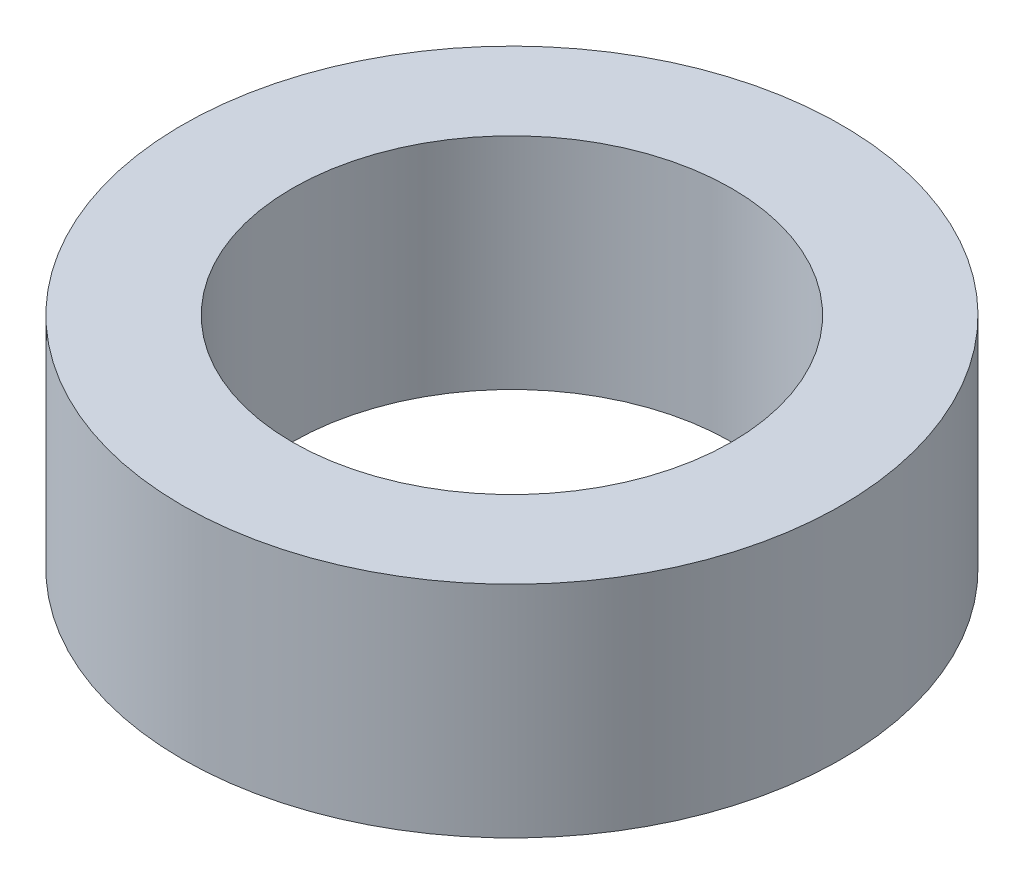
ISO-10303-21;
HEADER;
FILE_DESCRIPTION(('STEP AP214'),'2;1');
FILE_NAME('part.step','',(''),(''),'','','');
FILE_SCHEMA(('AUTOMOTIVE_DESIGN { 1 0 10303 214 1 1 1 1 }'));
ENDSEC;
DATA;
#1=APPLICATION_CONTEXT('core data for automotive mechanical design processes');
#2=APPLICATION_PROTOCOL_DEFINITION('international standard','automotive_design',2000,#1);
#3=PRODUCT_CONTEXT('',#1,'mechanical');
#4=PRODUCT('Part','Part','',(#3));
#5=PRODUCT_RELATED_PRODUCT_CATEGORY('part','',(#4));
#6=PRODUCT_DEFINITION_FORMATION('','',#4);
#7=PRODUCT_DEFINITION_CONTEXT('part definition',#1,'design');
#8=PRODUCT_DEFINITION('design','',#6,#7);
#9=PRODUCT_DEFINITION_SHAPE('','',#8);
#10=(LENGTH_UNIT() NAMED_UNIT(*) SI_UNIT(.MILLI.,.METRE.));
#11=(NAMED_UNIT(*) PLANE_ANGLE_UNIT() SI_UNIT($,.RADIAN.));
#12=(NAMED_UNIT(*) SI_UNIT($,.STERADIAN.) SOLID_ANGLE_UNIT());
#13=UNCERTAINTY_MEASURE_WITH_UNIT(LENGTH_MEASURE(1.E-05),#10,'distance_accuracy_value','');
#14=(GEOMETRIC_REPRESENTATION_CONTEXT(3) GLOBAL_UNCERTAINTY_ASSIGNED_CONTEXT((#13)) GLOBAL_UNIT_ASSIGNED_CONTEXT((#10,
#11,#12)) REPRESENTATION_CONTEXT('',''));
#15=CARTESIAN_POINT('',(0.,0.,0.));
#16=DIRECTION('',(0.,0.,1.));
#17=DIRECTION('',(1.,0.,0.));
#18=AXIS2_PLACEMENT_3D('',#15,#16,#17);
#19=CARTESIAN_POINT('',(0.,3.,0.));
#20=DIRECTION('',(0.,1.,0.));
#21=DIRECTION('',(0.,0.,1.));
#22=AXIS2_PLACEMENT_3D('',#19,#20,#21);
#23=PLANE('',#22);
#24=CARTESIAN_POINT('',(0.,3.,0.));
#25=DIRECTION('',(0.,1.,0.));
#26=DIRECTION('',(0.,0.,1.));
#27=AXIS2_PLACEMENT_3D('',#24,#25,#26);
#28=CIRCLE('',#27,4.5);
#29=CARTESIAN_POINT('',(0.,3.,4.5));
#30=VERTEX_POINT('',#29);
#31=EDGE_CURVE('E10',#30,#30,#28,.T.);
#32=ORIENTED_EDGE('',*,*,#31,.T.);
#33=EDGE_LOOP('',(#32));
#34=FACE_BOUND('',#33,.T.);
#35=CARTESIAN_POINT('',(0.,3.,0.));
#36=DIRECTION('',(0.,1.,0.));
#37=DIRECTION('',(0.,0.,1.));
#38=AXIS2_PLACEMENT_3D('',#35,#36,#37);
#39=CIRCLE('',#38,3.);
#40=CARTESIAN_POINT('',(0.,3.,3.));
#41=VERTEX_POINT('',#40);
#42=EDGE_CURVE('E50',#41,#41,#39,.T.);
#43=ORIENTED_EDGE('',*,*,#42,.F.);
#44=EDGE_LOOP('',(#43));
#45=FACE_BOUND('',#44,.T.);
#46=ADVANCED_FACE('F37',(#34,#45),#23,.T.);
#47=CARTESIAN_POINT('',(0.,0.,0.));
#48=DIRECTION('',(0.,1.,0.));
#49=DIRECTION('',(0.,0.,1.));
#50=AXIS2_PLACEMENT_3D('',#47,#48,#49);
#51=PLANE('',#50);
#52=CARTESIAN_POINT('',(0.,0.,0.));
#53=DIRECTION('',(0.,1.,0.));
#54=DIRECTION('',(0.,0.,1.));
#55=AXIS2_PLACEMENT_3D('',#52,#53,#54);
#56=CIRCLE('',#55,4.5);
#57=CARTESIAN_POINT('',(0.,0.,4.5));
#58=VERTEX_POINT('',#57);
#59=EDGE_CURVE('E41',#58,#58,#56,.T.);
#60=ORIENTED_EDGE('',*,*,#59,.F.);
#61=EDGE_LOOP('',(#60));
#62=FACE_BOUND('',#61,.T.);
#63=CARTESIAN_POINT('',(0.,0.,0.));
#64=DIRECTION('',(0.,1.,0.));
#65=DIRECTION('',(0.,0.,1.));
#66=AXIS2_PLACEMENT_3D('',#63,#64,#65);
#67=CIRCLE('',#66,3.);
#68=CARTESIAN_POINT('',(0.,0.,3.));
#69=VERTEX_POINT('',#68);
#70=EDGE_CURVE('E52',#69,#69,#67,.T.);
#71=ORIENTED_EDGE('',*,*,#70,.T.);
#72=EDGE_LOOP('',(#71));
#73=FACE_BOUND('',#72,.T.);
#74=ADVANCED_FACE('F64',(#62,#73),#51,.F.);
#75=CARTESIAN_POINT('',(0.,3.,0.));
#76=DIRECTION('',(0.,-1.,0.));
#77=DIRECTION('',(0.,0.,-1.));
#78=AXIS2_PLACEMENT_3D('',#75,#76,#77);
#79=CYLINDRICAL_SURFACE('',#78,4.5);
#80=ORIENTED_EDGE('',*,*,#31,.F.);
#81=EDGE_LOOP('',(#80));
#82=FACE_BOUND('',#81,.T.);
#83=ORIENTED_EDGE('',*,*,#59,.T.);
#84=EDGE_LOOP('',(#83));
#85=FACE_BOUND('',#84,.T.);
#86=ADVANCED_FACE('F39',(#82,#85),#79,.T.);
#87=CARTESIAN_POINT('',(0.,3.,0.));
#88=DIRECTION('',(0.,-1.,0.));
#89=DIRECTION('',(0.,0.,-1.));
#90=AXIS2_PLACEMENT_3D('',#87,#88,#89);
#91=CYLINDRICAL_SURFACE('',#90,3.);
#92=ORIENTED_EDGE('',*,*,#42,.T.);
#93=EDGE_LOOP('',(#92));
#94=FACE_BOUND('',#93,.T.);
#95=ORIENTED_EDGE('',*,*,#70,.F.);
#96=EDGE_LOOP('',(#95));
#97=FACE_BOUND('',#96,.T.);
#98=ADVANCED_FACE('F60',(#94,#97),#91,.F.);
#99=CLOSED_SHELL('',(#46,#74,#86,#98));
#100=MANIFOLD_SOLID_BREP('B2',#99);
#101=ADVANCED_BREP_SHAPE_REPRESENTATION('',(#18,#100),#14);
#102=SHAPE_DEFINITION_REPRESENTATION(#9,#101);
ENDSEC;
END-ISO-10303-21;
